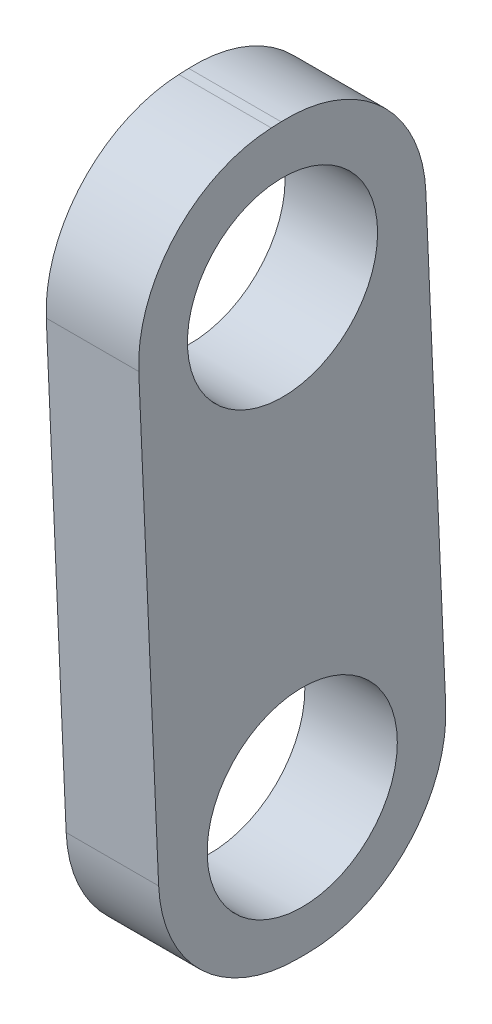
ISO-10303-21;
HEADER;
FILE_DESCRIPTION(('STEP AP214'),'2;1');
FILE_NAME('part.step','',(''),(''),'','','');
FILE_SCHEMA(('AUTOMOTIVE_DESIGN { 1 0 10303 214 1 1 1 1 }'));
ENDSEC;
DATA;
#1=APPLICATION_CONTEXT('core data for automotive mechanical design processes');
#2=APPLICATION_PROTOCOL_DEFINITION('international standard','automotive_design',2000,#1);
#3=PRODUCT_CONTEXT('',#1,'mechanical');
#4=PRODUCT('Part','Part','',(#3));
#5=PRODUCT_RELATED_PRODUCT_CATEGORY('part','',(#4));
#6=PRODUCT_DEFINITION_FORMATION('','',#4);
#7=PRODUCT_DEFINITION_CONTEXT('part definition',#1,'design');
#8=PRODUCT_DEFINITION('design','',#6,#7);
#9=PRODUCT_DEFINITION_SHAPE('','',#8);
#10=(LENGTH_UNIT() NAMED_UNIT(*) SI_UNIT(.MILLI.,.METRE.));
#11=(NAMED_UNIT(*) PLANE_ANGLE_UNIT() SI_UNIT($,.RADIAN.));
#12=(NAMED_UNIT(*) SI_UNIT($,.STERADIAN.) SOLID_ANGLE_UNIT());
#13=UNCERTAINTY_MEASURE_WITH_UNIT(LENGTH_MEASURE(1.E-05),#10,'distance_accuracy_value','');
#14=(GEOMETRIC_REPRESENTATION_CONTEXT(3) GLOBAL_UNCERTAINTY_ASSIGNED_CONTEXT((#13)) GLOBAL_UNIT_ASSIGNED_CONTEXT((#10,
#11,#12)) REPRESENTATION_CONTEXT('',''));
#15=CARTESIAN_POINT('',(0.,0.,0.));
#16=DIRECTION('',(0.,0.,1.));
#17=DIRECTION('',(1.,0.,0.));
#18=AXIS2_PLACEMENT_3D('',#15,#16,#17);
#19=CARTESIAN_POINT('',(3.175,0.,0.));
#20=DIRECTION('',(-1.,0.,0.));
#21=DIRECTION('',(0.,0.,1.));
#22=AXIS2_PLACEMENT_3D('',#19,#20,#21);
#23=PLANE('',#22);
#24=DIRECTION('',(0.,0.999048221581858,0.0436193873653358));
#25=VECTOR('',#24,1.);
#26=CARTESIAN_POINT('',(3.175,7.96326440588419,-182.388740952538));
#27=LINE('',#26,#25);
#28=CARTESIAN_POINT('',(3.175,0.245589324122006,-182.725701923669));
#29=VERTEX_POINT('',#28);
#30=CARTESIAN_POINT('',(3.175,15.8932096646902,-182.042512065326));
#31=VERTEX_POINT('',#30);
#32=EDGE_CURVE('E155',#29,#31,#27,.T.);
#33=ORIENTED_EDGE('',*,*,#32,.T.);
#34=CARTESIAN_POINT('',(3.175,15.6854723323628,-177.284544910042));
#35=DIRECTION('',(-1.,0.,0.));
#36=DIRECTION('',(0.,0.,1.));
#37=AXIS2_PLACEMENT_3D('',#34,#35,#36);
#38=CIRCLE('',#37,4.7625);
#39=CARTESIAN_POINT('',(3.175,20.4434394876464,-177.076807577715));
#40=VERTEX_POINT('',#39);
#41=EDGE_CURVE('E220',#31,#40,#38,.F.);
#42=ORIENTED_EDGE('',*,*,#41,.T.);
#43=DIRECTION('',(0.,-0.0436193873653367,0.999048221581858));
#44=VECTOR('',#43,1.);
#45=CARTESIAN_POINT('',(3.175,20.6511768199738,-181.834774732998));
#46=LINE('',#45,#44);
#47=CARTESIAN_POINT('',(3.175,20.4286764010665,-176.738677303918));
#48=VERTEX_POINT('',#47);
#49=EDGE_CURVE('E159',#40,#48,#46,.T.);
#50=ORIENTED_EDGE('',*,*,#49,.T.);
#51=CARTESIAN_POINT('',(3.175,15.6707092457829,-176.946414636246));
#52=DIRECTION('',(-1.,0.,0.));
#53=DIRECTION('',(0.,0.,1.));
#54=AXIS2_PLACEMENT_3D('',#51,#52,#53);
#55=CIRCLE('',#54,4.7625);
#56=CARTESIAN_POINT('',(3.175,15.4629719134555,-172.188447480962));
#57=VERTEX_POINT('',#56);
#58=EDGE_CURVE('E211',#48,#57,#55,.F.);
#59=ORIENTED_EDGE('',*,*,#58,.T.);
#60=DIRECTION('',(0.,-0.999048221581858,-0.0436193873653391));
#61=VECTOR('',#60,1.);
#62=CARTESIAN_POINT('',(3.175,-4.72464800820541,-173.06985800182));
#63=LINE('',#62,#61);
#64=CARTESIAN_POINT('',(3.175,-0.169885340532834,-172.870992769025));
#65=VERTEX_POINT('',#64);
#66=EDGE_CURVE('E164',#57,#65,#63,.T.);
#67=ORIENTED_EDGE('',*,*,#66,.T.);
#68=CARTESIAN_POINT('',(3.175,0.0378519917945936,-177.628959924309));
#69=DIRECTION('',(-1.,0.,0.));
#70=DIRECTION('',(0.,0.,1.));
#71=AXIS2_PLACEMENT_3D('',#68,#69,#70);
#72=CIRCLE('',#71,4.7625);
#73=CARTESIAN_POINT('',(3.175,-4.72464800820541,-177.628959924309));
#74=VERTEX_POINT('',#73);
#75=EDGE_CURVE('E214',#65,#74,#72,.F.);
#76=ORIENTED_EDGE('',*,*,#75,.T.);
#77=DIRECTION('',(0.,0.,-1.));
#78=VECTOR('',#77,1.);
#79=CARTESIAN_POINT('',(3.175,-4.7246480082054,-182.942707172078));
#80=LINE('',#79,#78);
#81=CARTESIAN_POINT('',(3.175,-4.72464800820541,-177.967734768386));
#82=VERTEX_POINT('',#81);
#83=EDGE_CURVE('E168',#74,#82,#80,.T.);
#84=ORIENTED_EDGE('',*,*,#83,.T.);
#85=CARTESIAN_POINT('',(3.175,0.0378519917945937,-177.967734768386));
#86=DIRECTION('',(-1.,0.,0.));
#87=DIRECTION('',(0.,0.,1.));
#88=AXIS2_PLACEMENT_3D('',#85,#86,#87);
#89=CIRCLE('',#88,4.7625);
#90=EDGE_CURVE('E217',#82,#29,#89,.F.);
#91=ORIENTED_EDGE('',*,*,#90,.T.);
#92=EDGE_LOOP('',(#33,#42,#50,#59,#67,#76,#84,#91));
#93=FACE_BOUND('',#92,.T.);
#94=CARTESIAN_POINT('',(3.175,15.4962910605337,-177.123417320712));
#95=DIRECTION('',(1.,0.,0.));
#96=DIRECTION('',(0.,0.,-1.));
#97=AXIS2_PLACEMENT_3D('',#94,#95,#96);
#98=CIRCLE('',#97,3.26389999999998);
#99=CARTESIAN_POINT('',(3.175,15.4962910605337,-180.387317320712));
#100=VERTEX_POINT('',#99);
#101=EDGE_CURVE('E148',#100,#100,#98,.T.);
#102=ORIENTED_EDGE('',*,*,#101,.F.);
#103=EDGE_LOOP('',(#102));
#104=FACE_BOUND('',#103,.T.);
#105=CARTESIAN_POINT('',(3.175,0.,-177.8));
#106=DIRECTION('',(1.,0.,0.));
#107=DIRECTION('',(0.,0.,-1.));
#108=AXIS2_PLACEMENT_3D('',#105,#106,#107);
#109=CIRCLE('',#108,3.26390000000001);
#110=CARTESIAN_POINT('',(3.175,0.,-181.0639));
#111=VERTEX_POINT('',#110);
#112=EDGE_CURVE('E139',#111,#111,#109,.T.);
#113=ORIENTED_EDGE('',*,*,#112,.F.);
#114=EDGE_LOOP('',(#113));
#115=FACE_BOUND('',#114,.T.);
#116=ADVANCED_FACE('F39',(#93,#104,#115),#23,.F.);
#117=CARTESIAN_POINT('',(0.,0.,0.));
#118=DIRECTION('',(-1.,0.,0.));
#119=DIRECTION('',(0.,0.,1.));
#120=AXIS2_PLACEMENT_3D('',#117,#118,#119);
#121=PLANE('',#120);
#122=DIRECTION('',(0.,0.0436193873653358,-0.999048221581858));
#123=VECTOR('',#122,1.);
#124=CARTESIAN_POINT('',(0.,11.0938075378479,-179.074033712187));
#125=LINE('',#124,#123);
#126=CARTESIAN_POINT('',(0.,11.0938075378479,-179.074033712187));
#127=VERTEX_POINT('',#126);
#128=CARTESIAN_POINT('',(0.,11.2322990927328,-182.246011815709));
#129=VERTEX_POINT('',#128);
#130=EDGE_CURVE('E55',#127,#129,#125,.T.);
#131=ORIENTED_EDGE('',*,*,#130,.F.);
#132=DIRECTION('',(0.,-0.999048221581858,-0.0436193873653358));
#133=VECTOR('',#132,1.);
#134=CARTESIAN_POINT('',(0.,7.82477285099917,-179.216762849016));
#135=LINE('',#134,#133);
#136=CARTESIAN_POINT('',(0.,4.7680083411944,-179.350224069763));
#137=VERTEX_POINT('',#136);
#138=EDGE_CURVE('E11',#127,#137,#135,.T.);
#139=ORIENTED_EDGE('',*,*,#138,.T.);
#140=DIRECTION('',(0.,0.0436193873653358,-0.999048221581858));
#141=VECTOR('',#140,1.);
#142=CARTESIAN_POINT('',(0.,4.7680083411944,-179.350224069763));
#143=LINE('',#142,#141);
#144=CARTESIAN_POINT('',(0.,4.90649989607934,-182.522202173285));
#145=VERTEX_POINT('',#144);
#146=EDGE_CURVE('E124',#145,#137,#143,.F.);
#147=ORIENTED_EDGE('',*,*,#146,.F.);
#148=DIRECTION('',(0.,0.999048221581858,0.0436193873653358));
#149=VECTOR('',#148,1.);
#150=CARTESIAN_POINT('',(0.,7.96326440588419,-182.388740952538));
#151=LINE('',#150,#149);
#152=CARTESIAN_POINT('',(0.,0.245589324122008,-182.725701923669));
#153=VERTEX_POINT('',#152);
#154=EDGE_CURVE('E172',#153,#145,#151,.T.);
#155=ORIENTED_EDGE('',*,*,#154,.F.);
#156=CARTESIAN_POINT('',(0.,0.0378519917945937,-177.967734768386));
#157=DIRECTION('',(-1.,0.,0.));
#158=DIRECTION('',(0.,0.,1.));
#159=AXIS2_PLACEMENT_3D('',#156,#157,#158);
#160=CIRCLE('',#159,4.7625);
#161=CARTESIAN_POINT('',(0.,-4.72464800820541,-177.967734768386));
#162=VERTEX_POINT('',#161);
#163=EDGE_CURVE('E198',#153,#162,#160,.T.);
#164=ORIENTED_EDGE('',*,*,#163,.T.);
#165=DIRECTION('',(0.,0.,-1.));
#166=VECTOR('',#165,1.);
#167=CARTESIAN_POINT('',(0.,-4.7246480082054,-182.942707172078));
#168=LINE('',#167,#166);
#169=CARTESIAN_POINT('',(0.,-4.72464800820541,-177.628959924309));
#170=VERTEX_POINT('',#169);
#171=EDGE_CURVE('E160',#170,#162,#168,.T.);
#172=ORIENTED_EDGE('',*,*,#171,.F.);
#173=CARTESIAN_POINT('',(0.,0.0378519917945936,-177.628959924309));
#174=DIRECTION('',(-1.,0.,0.));
#175=DIRECTION('',(0.,0.,1.));
#176=AXIS2_PLACEMENT_3D('',#173,#174,#175);
#177=CIRCLE('',#176,4.7625);
#178=CARTESIAN_POINT('',(0.,-0.169885340532834,-172.870992769025));
#179=VERTEX_POINT('',#178);
#180=EDGE_CURVE('E195',#170,#179,#177,.T.);
#181=ORIENTED_EDGE('',*,*,#180,.T.);
#182=DIRECTION('',(0.,-0.999048221581858,-0.0436193873653391));
#183=VECTOR('',#182,1.);
#184=CARTESIAN_POINT('',(0.,-4.72464800820541,-173.06985800182));
#185=LINE('',#184,#183);
#186=CARTESIAN_POINT('',(0.,15.4629719134555,-172.188447480962));
#187=VERTEX_POINT('',#186);
#188=EDGE_CURVE('E180',#187,#179,#185,.T.);
#189=ORIENTED_EDGE('',*,*,#188,.F.);
#190=CARTESIAN_POINT('',(0.,15.6707092457829,-176.946414636246));
#191=DIRECTION('',(-1.,0.,0.));
#192=DIRECTION('',(0.,0.,1.));
#193=AXIS2_PLACEMENT_3D('',#190,#191,#192);
#194=CIRCLE('',#193,4.7625);
#195=CARTESIAN_POINT('',(0.,20.4286764010665,-176.738677303918));
#196=VERTEX_POINT('',#195);
#197=EDGE_CURVE('E192',#187,#196,#194,.T.);
#198=ORIENTED_EDGE('',*,*,#197,.T.);
#199=DIRECTION('',(0.,-0.0436193873653367,0.999048221581858));
#200=VECTOR('',#199,1.);
#201=CARTESIAN_POINT('',(0.,20.6511768199738,-181.834774732998));
#202=LINE('',#201,#200);
#203=CARTESIAN_POINT('',(0.,20.4434394876464,-177.076807577715));
#204=VERTEX_POINT('',#203);
#205=EDGE_CURVE('E176',#204,#196,#202,.T.);
#206=ORIENTED_EDGE('',*,*,#205,.F.);
#207=CARTESIAN_POINT('',(0.,15.6854723323628,-177.284544910042));
#208=DIRECTION('',(-1.,0.,0.));
#209=DIRECTION('',(0.,0.,1.));
#210=AXIS2_PLACEMENT_3D('',#207,#208,#209);
#211=CIRCLE('',#210,4.7625);
#212=CARTESIAN_POINT('',(0.,15.8932096646902,-182.042512065326));
#213=VERTEX_POINT('',#212);
#214=EDGE_CURVE('E201',#204,#213,#211,.T.);
#215=ORIENTED_EDGE('',*,*,#214,.T.);
#216=EDGE_CURVE('E132',#129,#213,#151,.T.);
#217=ORIENTED_EDGE('',*,*,#216,.F.);
#218=EDGE_LOOP('',(#131,#139,#147,#155,#164,#172,#181,#189,#198,#206,#215,#217));
#219=FACE_BOUND('',#218,.T.);
#220=CARTESIAN_POINT('',(0.,15.4962910605337,-177.123417320712));
#221=DIRECTION('',(1.,0.,0.));
#222=DIRECTION('',(0.,0.,-1.));
#223=AXIS2_PLACEMENT_3D('',#220,#221,#222);
#224=CIRCLE('',#223,3.26389999999998);
#225=CARTESIAN_POINT('',(0.,15.4962910605337,-180.387317320712));
#226=VERTEX_POINT('',#225);
#227=EDGE_CURVE('E146',#226,#226,#224,.T.);
#228=ORIENTED_EDGE('',*,*,#227,.T.);
#229=EDGE_LOOP('',(#228));
#230=FACE_BOUND('',#229,.T.);
#231=CARTESIAN_POINT('',(0.,0.,-177.8));
#232=DIRECTION('',(1.,0.,0.));
#233=DIRECTION('',(0.,0.,-1.));
#234=AXIS2_PLACEMENT_3D('',#231,#232,#233);
#235=CIRCLE('',#234,3.26390000000001);
#236=CARTESIAN_POINT('',(0.,0.,-181.0639));
#237=VERTEX_POINT('',#236);
#238=EDGE_CURVE('E134',#237,#237,#235,.T.);
#239=ORIENTED_EDGE('',*,*,#238,.T.);
#240=EDGE_LOOP('',(#239));
#241=FACE_BOUND('',#240,.T.);
#242=ADVANCED_FACE('F129',(#219,#230,#241),#121,.T.);
#243=CARTESIAN_POINT('',(3.175,7.96326440588419,-182.388740952538));
#244=DIRECTION('',(0.,-0.0436193873653358,0.999048221581858));
#245=DIRECTION('',(0.,-0.999048221581858,-0.0436193873653358));
#246=AXIS2_PLACEMENT_3D('',#243,#244,#245);
#247=PLANE('',#246);
#248=ORIENTED_EDGE('',*,*,#154,.T.);
#249=CARTESIAN_POINT('',(-0.79375,8.0693994944061,-182.384106994497));
#250=DIRECTION('',(0.,0.0436193873653358,-0.999048221581858));
#251=DIRECTION('',(0.,0.999048221581858,0.0436193873653358));
#252=AXIS2_PLACEMENT_3D('',#249,#250,#251);
#253=CIRCLE('',#252,3.2639);
#254=EDGE_CURVE('E126',#129,#145,#253,.T.);
#255=ORIENTED_EDGE('',*,*,#254,.F.);
#256=ORIENTED_EDGE('',*,*,#216,.T.);
#257=DIRECTION('',(-1.,0.,0.));
#258=VECTOR('',#257,1.);
#259=CARTESIAN_POINT('',(3.175,15.8932096646902,-182.042512065326));
#260=LINE('',#259,#258);
#261=EDGE_CURVE('E208',#213,#31,#260,.F.);
#262=ORIENTED_EDGE('',*,*,#261,.T.);
#263=ORIENTED_EDGE('',*,*,#32,.F.);
#264=DIRECTION('',(-1.,0.,0.));
#265=VECTOR('',#264,1.);
#266=CARTESIAN_POINT('',(3.175,0.245589324122005,-182.725701923669));
#267=LINE('',#266,#265);
#268=EDGE_CURVE('E204',#29,#153,#267,.T.);
#269=ORIENTED_EDGE('',*,*,#268,.T.);
#270=EDGE_LOOP('',(#248,#255,#256,#262,#263,#269));
#271=FACE_BOUND('',#270,.T.);
#272=ADVANCED_FACE('F255',(#271),#247,.F.);
#273=CARTESIAN_POINT('',(3.175,20.6511768199738,-181.834774732998));
#274=DIRECTION('',(0.,-0.999048221581858,-0.0436193873653367));
#275=DIRECTION('',(0.,0.0436193873653367,-0.999048221581858));
#276=AXIS2_PLACEMENT_3D('',#273,#274,#275);
#277=PLANE('',#276);
#278=ORIENTED_EDGE('',*,*,#49,.F.);
#279=DIRECTION('',(-1.,0.,0.));
#280=VECTOR('',#279,1.);
#281=CARTESIAN_POINT('',(3.175,20.4434394876464,-177.076807577715));
#282=LINE('',#281,#280);
#283=EDGE_CURVE('E188',#40,#204,#282,.T.);
#284=ORIENTED_EDGE('',*,*,#283,.T.);
#285=ORIENTED_EDGE('',*,*,#205,.T.);
#286=DIRECTION('',(-1.,0.,0.));
#287=VECTOR('',#286,1.);
#288=CARTESIAN_POINT('',(3.175,20.4286764010665,-176.738677303918));
#289=LINE('',#288,#287);
#290=EDGE_CURVE('E171',#196,#48,#289,.F.);
#291=ORIENTED_EDGE('',*,*,#290,.T.);
#292=EDGE_LOOP('',(#278,#284,#285,#291));
#293=FACE_BOUND('',#292,.T.);
#294=ADVANCED_FACE('F264',(#293),#277,.F.);
#295=CARTESIAN_POINT('',(3.175,-4.72464800820541,-173.06985800182));
#296=DIRECTION('',(0.,0.0436193873653391,-0.999048221581858));
#297=DIRECTION('',(0.,0.999048221581858,0.0436193873653391));
#298=AXIS2_PLACEMENT_3D('',#295,#296,#297);
#299=PLANE('',#298);
#300=ORIENTED_EDGE('',*,*,#188,.T.);
#301=DIRECTION('',(-1.,0.,0.));
#302=VECTOR('',#301,1.);
#303=CARTESIAN_POINT('',(3.175,-0.169885340532834,-172.870992769025));
#304=LINE('',#303,#302);
#305=EDGE_CURVE('E48',#179,#65,#304,.F.);
#306=ORIENTED_EDGE('',*,*,#305,.T.);
#307=ORIENTED_EDGE('',*,*,#66,.F.);
#308=DIRECTION('',(-1.,0.,0.));
#309=VECTOR('',#308,1.);
#310=CARTESIAN_POINT('',(3.175,15.4629719134555,-172.188447480962));
#311=LINE('',#310,#309);
#312=EDGE_CURVE('E229',#57,#187,#311,.T.);
#313=ORIENTED_EDGE('',*,*,#312,.T.);
#314=EDGE_LOOP('',(#300,#306,#307,#313));
#315=FACE_BOUND('',#314,.T.);
#316=ADVANCED_FACE('F236',(#315),#299,.F.);
#317=CARTESIAN_POINT('',(3.175,-4.7246480082054,-182.942707172078));
#318=DIRECTION('',(0.,1.,0.));
#319=DIRECTION('',(0.,0.,1.));
#320=AXIS2_PLACEMENT_3D('',#317,#318,#319);
#321=PLANE('',#320);
#322=ORIENTED_EDGE('',*,*,#171,.T.);
#323=DIRECTION('',(-1.,0.,0.));
#324=VECTOR('',#323,1.);
#325=CARTESIAN_POINT('',(3.175,-4.72464800820541,-177.967734768386));
#326=LINE('',#325,#324);
#327=EDGE_CURVE('E63',#162,#82,#326,.F.);
#328=ORIENTED_EDGE('',*,*,#327,.T.);
#329=ORIENTED_EDGE('',*,*,#83,.F.);
#330=DIRECTION('',(-1.,0.,0.));
#331=VECTOR('',#330,1.);
#332=CARTESIAN_POINT('',(3.175,-4.72464800820541,-177.628959924309));
#333=LINE('',#332,#331);
#334=EDGE_CURVE('E223',#74,#170,#333,.T.);
#335=ORIENTED_EDGE('',*,*,#334,.T.);
#336=EDGE_LOOP('',(#322,#328,#329,#335));
#337=FACE_BOUND('',#336,.T.);
#338=ADVANCED_FACE('F247',(#337),#321,.F.);
#339=CARTESIAN_POINT('',(3.175,15.4962910605337,-177.123417320712));
#340=DIRECTION('',(-1.,0.,0.));
#341=DIRECTION('',(0.,0.,1.));
#342=AXIS2_PLACEMENT_3D('',#339,#340,#341);
#343=CYLINDRICAL_SURFACE('',#342,3.26389999999998);
#344=ORIENTED_EDGE('',*,*,#101,.T.);
#345=EDGE_LOOP('',(#344));
#346=FACE_BOUND('',#345,.T.);
#347=ORIENTED_EDGE('',*,*,#227,.F.);
#348=EDGE_LOOP('',(#347));
#349=FACE_BOUND('',#348,.T.);
#350=ADVANCED_FACE('F280',(#346,#349),#343,.F.);
#351=CARTESIAN_POINT('',(3.175,0.,-177.8));
#352=DIRECTION('',(-1.,0.,0.));
#353=DIRECTION('',(0.,0.,1.));
#354=AXIS2_PLACEMENT_3D('',#351,#352,#353);
#355=CYLINDRICAL_SURFACE('',#354,3.26390000000001);
#356=ORIENTED_EDGE('',*,*,#112,.T.);
#357=EDGE_LOOP('',(#356));
#358=FACE_BOUND('',#357,.T.);
#359=ORIENTED_EDGE('',*,*,#238,.F.);
#360=EDGE_LOOP('',(#359));
#361=FACE_BOUND('',#360,.T.);
#362=ADVANCED_FACE('F293',(#358,#361),#355,.F.);
#363=CARTESIAN_POINT('',(3.175,15.6854723323628,-177.284544910042));
#364=DIRECTION('',(-1.,0.,0.));
#365=DIRECTION('',(0.,0.,1.));
#366=AXIS2_PLACEMENT_3D('',#363,#364,#365);
#367=CYLINDRICAL_SURFACE('',#366,4.7625);
#368=ORIENTED_EDGE('',*,*,#41,.F.);
#369=ORIENTED_EDGE('',*,*,#261,.F.);
#370=ORIENTED_EDGE('',*,*,#214,.F.);
#371=ORIENTED_EDGE('',*,*,#283,.F.);
#372=EDGE_LOOP('',(#368,#369,#370,#371));
#373=FACE_BOUND('',#372,.T.);
#374=ADVANCED_FACE('F261',(#373),#367,.T.);
#375=CARTESIAN_POINT('',(3.175,0.0378519917945937,-177.967734768386));
#376=DIRECTION('',(-1.,0.,0.));
#377=DIRECTION('',(0.,0.,1.));
#378=AXIS2_PLACEMENT_3D('',#375,#376,#377);
#379=CYLINDRICAL_SURFACE('',#378,4.7625);
#380=ORIENTED_EDGE('',*,*,#90,.F.);
#381=ORIENTED_EDGE('',*,*,#327,.F.);
#382=ORIENTED_EDGE('',*,*,#163,.F.);
#383=ORIENTED_EDGE('',*,*,#268,.F.);
#384=EDGE_LOOP('',(#380,#381,#382,#383));
#385=FACE_BOUND('',#384,.T.);
#386=ADVANCED_FACE('F252',(#385),#379,.T.);
#387=CARTESIAN_POINT('',(3.175,0.0378519917945936,-177.628959924309));
#388=DIRECTION('',(-1.,0.,0.));
#389=DIRECTION('',(0.,0.,1.));
#390=AXIS2_PLACEMENT_3D('',#387,#388,#389);
#391=CYLINDRICAL_SURFACE('',#390,4.7625);
#392=ORIENTED_EDGE('',*,*,#75,.F.);
#393=ORIENTED_EDGE('',*,*,#305,.F.);
#394=ORIENTED_EDGE('',*,*,#180,.F.);
#395=ORIENTED_EDGE('',*,*,#334,.F.);
#396=EDGE_LOOP('',(#392,#393,#394,#395));
#397=FACE_BOUND('',#396,.T.);
#398=ADVANCED_FACE('F245',(#397),#391,.T.);
#399=CARTESIAN_POINT('',(3.175,15.6707092457829,-176.946414636246));
#400=DIRECTION('',(-1.,0.,0.));
#401=DIRECTION('',(0.,0.,1.));
#402=AXIS2_PLACEMENT_3D('',#399,#400,#401);
#403=CYLINDRICAL_SURFACE('',#402,4.7625);
#404=ORIENTED_EDGE('',*,*,#58,.F.);
#405=ORIENTED_EDGE('',*,*,#290,.F.);
#406=ORIENTED_EDGE('',*,*,#197,.F.);
#407=ORIENTED_EDGE('',*,*,#312,.F.);
#408=EDGE_LOOP('',(#404,#405,#406,#407));
#409=FACE_BOUND('',#408,.T.);
#410=ADVANCED_FACE('F41',(#409),#403,.T.);
#411=CARTESIAN_POINT('',(-0.79375,7.93090793952116,-179.212128890975));
#412=DIRECTION('',(0.,0.0436193873653358,-0.999048221581858));
#413=DIRECTION('',(0.,0.999048221581858,0.0436193873653358));
#414=AXIS2_PLACEMENT_3D('',#411,#412,#413);
#415=CYLINDRICAL_SURFACE('',#414,3.2639);
#416=ORIENTED_EDGE('',*,*,#130,.T.);
#417=ORIENTED_EDGE('',*,*,#254,.T.);
#418=ORIENTED_EDGE('',*,*,#146,.T.);
#419=CARTESIAN_POINT('',(-0.79375,7.93090793952116,-179.212128890975));
#420=DIRECTION('',(0.,0.0436193873653358,-0.999048221581858));
#421=DIRECTION('',(0.,0.999048221581858,0.0436193873653358));
#422=AXIS2_PLACEMENT_3D('',#419,#420,#421);
#423=CIRCLE('',#422,3.2639);
#424=EDGE_CURVE('E120',#127,#137,#423,.T.);
#425=ORIENTED_EDGE('',*,*,#424,.F.);
#426=EDGE_LOOP('',(#416,#417,#418,#425));
#427=FACE_BOUND('',#426,.T.);
#428=ADVANCED_FACE('F123',(#427),#415,.F.);
#429=CARTESIAN_POINT('',(-0.79375,7.93090793952116,-179.212128890975));
#430=DIRECTION('',(0.,0.0436193873653358,-0.999048221581858));
#431=DIRECTION('',(0.,0.999048221581858,0.0436193873653358));
#432=AXIS2_PLACEMENT_3D('',#429,#430,#431);
#433=PLANE('',#432);
#434=ORIENTED_EDGE('',*,*,#424,.T.);
#435=ORIENTED_EDGE('',*,*,#138,.F.);
#436=EDGE_LOOP('',(#434,#435));
#437=FACE_BOUND('',#436,.T.);
#438=ADVANCED_FACE('F119',(#437),#433,.T.);
#439=CLOSED_SHELL('',(#116,#242,#272,#294,#316,#338,#350,#362,#374,#386,#398,#410,#428,#438));
#440=MANIFOLD_SOLID_BREP('B2',#439);
#441=ADVANCED_BREP_SHAPE_REPRESENTATION('',(#18,#440),#14);
#442=SHAPE_DEFINITION_REPRESENTATION(#9,#441);
ENDSEC;
END-ISO-10303-21;
